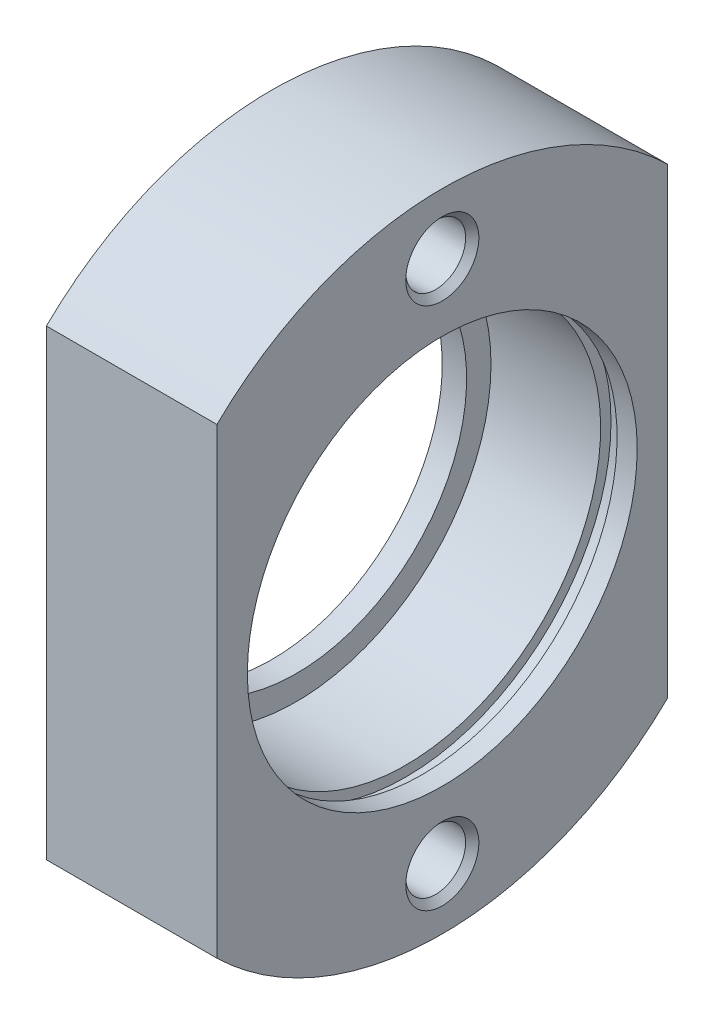
ISO-10303-21;
HEADER;
FILE_DESCRIPTION(('STEP AP214'),'2;1');
FILE_NAME('part.step','',(''),(''),'','','');
FILE_SCHEMA(('AUTOMOTIVE_DESIGN { 1 0 10303 214 1 1 1 1 }'));
ENDSEC;
DATA;
#1=APPLICATION_CONTEXT('core data for automotive mechanical design processes');
#2=APPLICATION_PROTOCOL_DEFINITION('international standard','automotive_design',2000,#1);
#3=PRODUCT_CONTEXT('',#1,'mechanical');
#4=PRODUCT('Part','Part','',(#3));
#5=PRODUCT_RELATED_PRODUCT_CATEGORY('part','',(#4));
#6=PRODUCT_DEFINITION_FORMATION('','',#4);
#7=PRODUCT_DEFINITION_CONTEXT('part definition',#1,'design');
#8=PRODUCT_DEFINITION('design','',#6,#7);
#9=PRODUCT_DEFINITION_SHAPE('','',#8);
#10=(LENGTH_UNIT() NAMED_UNIT(*) SI_UNIT(.MILLI.,.METRE.));
#11=(NAMED_UNIT(*) PLANE_ANGLE_UNIT() SI_UNIT($,.RADIAN.));
#12=(NAMED_UNIT(*) SI_UNIT($,.STERADIAN.) SOLID_ANGLE_UNIT());
#13=UNCERTAINTY_MEASURE_WITH_UNIT(LENGTH_MEASURE(1.E-05),#10,'distance_accuracy_value','');
#14=(GEOMETRIC_REPRESENTATION_CONTEXT(3) GLOBAL_UNCERTAINTY_ASSIGNED_CONTEXT((#13)) GLOBAL_UNIT_ASSIGNED_CONTEXT((#10,
#11,#12)) REPRESENTATION_CONTEXT('',''));
#15=CARTESIAN_POINT('',(0.,0.,0.));
#16=DIRECTION('',(0.,0.,1.));
#17=DIRECTION('',(1.,0.,0.));
#18=AXIS2_PLACEMENT_3D('',#15,#16,#17);
#19=CARTESIAN_POINT('',(7.,0.,0.));
#20=DIRECTION('',(-1.,0.,0.));
#21=DIRECTION('',(0.,0.,1.));
#22=AXIS2_PLACEMENT_3D('',#19,#20,#21);
#23=CYLINDRICAL_SURFACE('',#22,16.);
#24=CARTESIAN_POINT('',(-5.,0.,0.));
#25=DIRECTION('',(-1.,0.,0.));
#26=DIRECTION('',(0.,0.,1.));
#27=AXIS2_PLACEMENT_3D('',#24,#25,#26);
#28=CIRCLE('',#27,16.);
#29=CARTESIAN_POINT('',(-5.,0.,16.));
#30=VERTEX_POINT('',#29);
#31=EDGE_CURVE('E131',#30,#30,#28,.T.);
#32=ORIENTED_EDGE('',*,*,#31,.T.);
#33=EDGE_LOOP('',(#32));
#34=FACE_BOUND('',#33,.T.);
#35=CARTESIAN_POINT('',(3.99999999999996,0.,0.));
#36=DIRECTION('',(1.,0.,0.));
#37=DIRECTION('',(0.,1.,0.));
#38=AXIS2_PLACEMENT_3D('',#35,#36,#37);
#39=CIRCLE('',#38,16.);
#40=CARTESIAN_POINT('',(4.00000000000004,16.,0.));
#41=VERTEX_POINT('',#40);
#42=EDGE_CURVE('E37',#41,#41,#39,.T.);
#43=ORIENTED_EDGE('',*,*,#42,.T.);
#44=EDGE_LOOP('',(#43));
#45=FACE_BOUND('',#44,.T.);
#46=ADVANCED_FACE('F33',(#34,#45),#23,.F.);
#47=CARTESIAN_POINT('',(7.,0.,0.));
#48=DIRECTION('',(-1.,0.,0.));
#49=DIRECTION('',(0.,0.,1.));
#50=AXIS2_PLACEMENT_3D('',#47,#48,#49);
#51=CIRCLE('',#50,16.);
#52=CARTESIAN_POINT('',(7.,0.,16.));
#53=VERTEX_POINT('',#52);
#54=EDGE_CURVE('E118',#53,#53,#51,.T.);
#55=ORIENTED_EDGE('',*,*,#54,.F.);
#56=EDGE_LOOP('',(#55));
#57=FACE_BOUND('',#56,.T.);
#58=CARTESIAN_POINT('',(5.34999999999996,0.,0.));
#59=DIRECTION('',(-1.,0.,0.));
#60=DIRECTION('',(0.,-1.,0.));
#61=AXIS2_PLACEMENT_3D('',#58,#59,#60);
#62=CIRCLE('',#61,16.);
#63=CARTESIAN_POINT('',(5.34999999999987,-16.,0.));
#64=VERTEX_POINT('',#63);
#65=EDGE_CURVE('E112',#64,#64,#62,.T.);
#66=ORIENTED_EDGE('',*,*,#65,.T.);
#67=EDGE_LOOP('',(#66));
#68=FACE_BOUND('',#67,.T.);
#69=ADVANCED_FACE('F153',(#57,#68),#23,.F.);
#70=CARTESIAN_POINT('',(7.,-6.83481049534862E-13,0.));
#71=DIRECTION('',(-1.,0.,0.));
#72=DIRECTION('',(0.,0.,1.));
#73=AXIS2_PLACEMENT_3D('',#70,#71,#72);
#74=CYLINDRICAL_SURFACE('',#73,26.5000000000003);
#75=DIRECTION('',(-1.,0.,0.));
#76=VECTOR('',#75,1.);
#77=CARTESIAN_POINT('',(7.,18.97366596101,-18.5));
#78=LINE('',#77,#76);
#79=CARTESIAN_POINT('',(7.,18.97366596101,-18.5));
#80=VERTEX_POINT('',#79);
#81=CARTESIAN_POINT('',(-7.,18.97366596101,-18.5));
#82=VERTEX_POINT('',#81);
#83=EDGE_CURVE('E93',#80,#82,#78,.T.);
#84=ORIENTED_EDGE('',*,*,#83,.T.);
#85=CARTESIAN_POINT('',(-7.,-6.83481049534862E-13,0.));
#86=DIRECTION('',(1.,0.,0.));
#87=DIRECTION('',(0.,0.,-1.));
#88=AXIS2_PLACEMENT_3D('',#85,#86,#87);
#89=CIRCLE('',#88,26.5000000000003);
#90=CARTESIAN_POINT('',(-7.,18.97366596101,18.5));
#91=VERTEX_POINT('',#90);
#92=EDGE_CURVE('E88',#82,#91,#89,.T.);
#93=ORIENTED_EDGE('',*,*,#92,.T.);
#94=DIRECTION('',(-1.,0.,0.));
#95=VECTOR('',#94,1.);
#96=CARTESIAN_POINT('',(7.,18.97366596101,18.5));
#97=LINE('',#96,#95);
#98=CARTESIAN_POINT('',(7.,18.97366596101,18.5));
#99=VERTEX_POINT('',#98);
#100=EDGE_CURVE('E11',#99,#91,#97,.T.);
#101=ORIENTED_EDGE('',*,*,#100,.F.);
#102=CARTESIAN_POINT('',(7.,-6.83481049534862E-13,0.));
#103=DIRECTION('',(1.,0.,0.));
#104=DIRECTION('',(0.,0.,-1.));
#105=AXIS2_PLACEMENT_3D('',#102,#103,#104);
#106=CIRCLE('',#105,26.5000000000003);
#107=EDGE_CURVE('E104',#80,#99,#106,.T.);
#108=ORIENTED_EDGE('',*,*,#107,.F.);
#109=EDGE_LOOP('',(#84,#93,#101,#108));
#110=FACE_BOUND('',#109,.T.);
#111=ADVANCED_FACE('F35',(#110),#74,.T.);
#112=CARTESIAN_POINT('',(7.,18.97366596101,18.5));
#113=DIRECTION('',(0.,0.,-1.));
#114=DIRECTION('',(-1.,0.,0.));
#115=AXIS2_PLACEMENT_3D('',#112,#113,#114);
#116=PLANE('',#115);
#117=ORIENTED_EDGE('',*,*,#100,.T.);
#118=DIRECTION('',(0.,-1.,0.));
#119=VECTOR('',#118,1.);
#120=CARTESIAN_POINT('',(-7.,18.97366596101,18.5));
#121=LINE('',#120,#119);
#122=CARTESIAN_POINT('',(-7.,-18.97366596101,18.5));
#123=VERTEX_POINT('',#122);
#124=EDGE_CURVE('E78',#91,#123,#121,.T.);
#125=ORIENTED_EDGE('',*,*,#124,.T.);
#126=DIRECTION('',(-1.,0.,0.));
#127=VECTOR('',#126,1.);
#128=CARTESIAN_POINT('',(7.,-18.97366596101,18.5));
#129=LINE('',#128,#127);
#130=CARTESIAN_POINT('',(7.,-18.97366596101,18.5));
#131=VERTEX_POINT('',#130);
#132=EDGE_CURVE('E42',#131,#123,#129,.T.);
#133=ORIENTED_EDGE('',*,*,#132,.F.);
#134=DIRECTION('',(0.,-1.,0.));
#135=VECTOR('',#134,1.);
#136=CARTESIAN_POINT('',(7.,18.97366596101,18.5));
#137=LINE('',#136,#135);
#138=EDGE_CURVE('E79',#99,#131,#137,.T.);
#139=ORIENTED_EDGE('',*,*,#138,.F.);
#140=EDGE_LOOP('',(#117,#125,#133,#139));
#141=FACE_BOUND('',#140,.T.);
#142=ADVANCED_FACE('F76',(#141),#116,.F.);
#143=CARTESIAN_POINT('',(7.,-6.83481049534862E-13,0.));
#144=DIRECTION('',(-1.,0.,0.));
#145=DIRECTION('',(0.,0.,1.));
#146=AXIS2_PLACEMENT_3D('',#143,#144,#145);
#147=CYLINDRICAL_SURFACE('',#146,26.4999999999993);
#148=ORIENTED_EDGE('',*,*,#132,.T.);
#149=CARTESIAN_POINT('',(-7.,-6.83481049534862E-13,0.));
#150=DIRECTION('',(1.,0.,0.));
#151=DIRECTION('',(0.,0.,-1.));
#152=AXIS2_PLACEMENT_3D('',#149,#150,#151);
#153=CIRCLE('',#152,26.4999999999993);
#154=CARTESIAN_POINT('',(-7.,-18.97366596101,-18.5));
#155=VERTEX_POINT('',#154);
#156=EDGE_CURVE('E91',#123,#155,#153,.T.);
#157=ORIENTED_EDGE('',*,*,#156,.T.);
#158=DIRECTION('',(-1.,0.,0.));
#159=VECTOR('',#158,1.);
#160=CARTESIAN_POINT('',(7.,-18.97366596101,-18.5));
#161=LINE('',#160,#159);
#162=CARTESIAN_POINT('',(7.,-18.97366596101,-18.5));
#163=VERTEX_POINT('',#162);
#164=EDGE_CURVE('E110',#163,#155,#161,.T.);
#165=ORIENTED_EDGE('',*,*,#164,.F.);
#166=CARTESIAN_POINT('',(7.,-6.83481049534862E-13,0.));
#167=DIRECTION('',(1.,0.,0.));
#168=DIRECTION('',(0.,0.,-1.));
#169=AXIS2_PLACEMENT_3D('',#166,#167,#168);
#170=CIRCLE('',#169,26.4999999999993);
#171=EDGE_CURVE('E55',#131,#163,#170,.T.);
#172=ORIENTED_EDGE('',*,*,#171,.F.);
#173=EDGE_LOOP('',(#148,#157,#165,#172));
#174=FACE_BOUND('',#173,.T.);
#175=ADVANCED_FACE('F240',(#174),#147,.T.);
#176=CARTESIAN_POINT('',(7.,-18.97366596101,-18.5));
#177=DIRECTION('',(0.,0.,1.));
#178=DIRECTION('',(1.,0.,0.));
#179=AXIS2_PLACEMENT_3D('',#176,#177,#178);
#180=PLANE('',#179);
#181=ORIENTED_EDGE('',*,*,#164,.T.);
#182=DIRECTION('',(0.,1.,0.));
#183=VECTOR('',#182,1.);
#184=CARTESIAN_POINT('',(-7.,-18.97366596101,-18.5));
#185=LINE('',#184,#183);
#186=EDGE_CURVE('E102',#155,#82,#185,.T.);
#187=ORIENTED_EDGE('',*,*,#186,.T.);
#188=ORIENTED_EDGE('',*,*,#83,.F.);
#189=DIRECTION('',(0.,1.,0.));
#190=VECTOR('',#189,1.);
#191=CARTESIAN_POINT('',(7.,-18.97366596101,-18.5));
#192=LINE('',#191,#190);
#193=EDGE_CURVE('E50',#163,#80,#192,.T.);
#194=ORIENTED_EDGE('',*,*,#193,.F.);
#195=EDGE_LOOP('',(#181,#187,#188,#194));
#196=FACE_BOUND('',#195,.T.);
#197=ADVANCED_FACE('F236',(#196),#180,.F.);
#198=CARTESIAN_POINT('',(7.,-6.83481049534862E-13,0.));
#199=DIRECTION('',(1.,0.,0.));
#200=DIRECTION('',(0.,0.,-1.));
#201=AXIS2_PLACEMENT_3D('',#198,#199,#200);
#202=PLANE('',#201);
#203=CARTESIAN_POINT('',(7.,21.5,0.));
#204=DIRECTION('',(-1.,0.,0.));
#205=DIRECTION('',(0.,0.,1.));
#206=AXIS2_PLACEMENT_3D('',#203,#204,#205);
#207=CIRCLE('',#206,3.);
#208=CARTESIAN_POINT('',(7.,21.5,3.));
#209=VERTEX_POINT('',#208);
#210=EDGE_CURVE('E203',#209,#209,#207,.T.);
#211=ORIENTED_EDGE('',*,*,#210,.T.);
#212=EDGE_LOOP('',(#211));
#213=FACE_BOUND('',#212,.T.);
#214=CARTESIAN_POINT('',(7.,-21.5,0.));
#215=DIRECTION('',(-1.,0.,0.));
#216=DIRECTION('',(0.,0.,1.));
#217=AXIS2_PLACEMENT_3D('',#214,#215,#216);
#218=CIRCLE('',#217,3.);
#219=CARTESIAN_POINT('',(7.,-21.5,3.));
#220=VERTEX_POINT('',#219);
#221=EDGE_CURVE('E214',#220,#220,#218,.T.);
#222=ORIENTED_EDGE('',*,*,#221,.T.);
#223=EDGE_LOOP('',(#222));
#224=FACE_BOUND('',#223,.T.);
#225=ORIENTED_EDGE('',*,*,#54,.T.);
#226=EDGE_LOOP('',(#225));
#227=FACE_BOUND('',#226,.T.);
#228=ORIENTED_EDGE('',*,*,#107,.T.);
#229=ORIENTED_EDGE('',*,*,#138,.T.);
#230=ORIENTED_EDGE('',*,*,#171,.T.);
#231=ORIENTED_EDGE('',*,*,#193,.T.);
#232=EDGE_LOOP('',(#228,#229,#230,#231));
#233=FACE_BOUND('',#232,.T.);
#234=ADVANCED_FACE('F149',(#213,#224,#227,#233),#202,.T.);
#235=CARTESIAN_POINT('',(-7.,-6.83481049534862E-13,0.));
#236=DIRECTION('',(1.,0.,0.));
#237=DIRECTION('',(0.,0.,-1.));
#238=AXIS2_PLACEMENT_3D('',#235,#236,#237);
#239=PLANE('',#238);
#240=CARTESIAN_POINT('',(-7.,21.5,0.));
#241=DIRECTION('',(-1.,0.,0.));
#242=DIRECTION('',(0.,0.,1.));
#243=AXIS2_PLACEMENT_3D('',#240,#241,#242);
#244=CIRCLE('',#243,3.);
#245=CARTESIAN_POINT('',(-7.,21.5,3.));
#246=VERTEX_POINT('',#245);
#247=EDGE_CURVE('E211',#246,#246,#244,.T.);
#248=ORIENTED_EDGE('',*,*,#247,.F.);
#249=EDGE_LOOP('',(#248));
#250=FACE_BOUND('',#249,.T.);
#251=CARTESIAN_POINT('',(-7.,-21.5,0.));
#252=DIRECTION('',(-1.,0.,0.));
#253=DIRECTION('',(0.,0.,1.));
#254=AXIS2_PLACEMENT_3D('',#251,#252,#253);
#255=CIRCLE('',#254,3.);
#256=CARTESIAN_POINT('',(-7.,-21.5,3.));
#257=VERTEX_POINT('',#256);
#258=EDGE_CURVE('E125',#257,#257,#255,.T.);
#259=ORIENTED_EDGE('',*,*,#258,.F.);
#260=EDGE_LOOP('',(#259));
#261=FACE_BOUND('',#260,.T.);
#262=CARTESIAN_POINT('',(-7.,0.,0.));
#263=DIRECTION('',(-1.,0.,0.));
#264=DIRECTION('',(0.,0.,1.));
#265=AXIS2_PLACEMENT_3D('',#262,#263,#264);
#266=CIRCLE('',#265,14.);
#267=CARTESIAN_POINT('',(-7.,0.,14.));
#268=VERTEX_POINT('',#267);
#269=EDGE_CURVE('E94',#268,#268,#266,.T.);
#270=ORIENTED_EDGE('',*,*,#269,.F.);
#271=EDGE_LOOP('',(#270));
#272=FACE_BOUND('',#271,.T.);
#273=ORIENTED_EDGE('',*,*,#92,.F.);
#274=ORIENTED_EDGE('',*,*,#186,.F.);
#275=ORIENTED_EDGE('',*,*,#156,.F.);
#276=ORIENTED_EDGE('',*,*,#124,.F.);
#277=EDGE_LOOP('',(#273,#274,#275,#276));
#278=FACE_BOUND('',#277,.T.);
#279=ADVANCED_FACE('F86',(#250,#261,#272,#278),#239,.F.);
#280=CARTESIAN_POINT('',(7.,0.,0.));
#281=DIRECTION('',(-1.,0.,0.));
#282=DIRECTION('',(0.,0.,1.));
#283=AXIS2_PLACEMENT_3D('',#280,#281,#282);
#284=CYLINDRICAL_SURFACE('',#283,14.);
#285=ORIENTED_EDGE('',*,*,#269,.T.);
#286=EDGE_LOOP('',(#285));
#287=FACE_BOUND('',#286,.T.);
#288=CARTESIAN_POINT('',(-5.,0.,0.));
#289=DIRECTION('',(-1.,0.,0.));
#290=DIRECTION('',(0.,0.,1.));
#291=AXIS2_PLACEMENT_3D('',#288,#289,#290);
#292=CIRCLE('',#291,14.);
#293=CARTESIAN_POINT('',(-5.,0.,14.));
#294=VERTEX_POINT('',#293);
#295=EDGE_CURVE('E97',#294,#294,#292,.T.);
#296=ORIENTED_EDGE('',*,*,#295,.F.);
#297=EDGE_LOOP('',(#296));
#298=FACE_BOUND('',#297,.T.);
#299=ADVANCED_FACE('F139',(#287,#298),#284,.F.);
#300=CARTESIAN_POINT('',(-5.,14.,0.));
#301=DIRECTION('',(1.,0.,0.));
#302=DIRECTION('',(0.,0.,-1.));
#303=AXIS2_PLACEMENT_3D('',#300,#301,#302);
#304=PLANE('',#303);
#305=ORIENTED_EDGE('',*,*,#295,.T.);
#306=EDGE_LOOP('',(#305));
#307=FACE_BOUND('',#306,.T.);
#308=ORIENTED_EDGE('',*,*,#31,.F.);
#309=EDGE_LOOP('',(#308));
#310=FACE_BOUND('',#309,.T.);
#311=ADVANCED_FACE('F136',(#307,#310),#304,.T.);
#312=CARTESIAN_POINT('',(3.99999999999996,0.,0.));
#313=DIRECTION('',(1.,0.,0.));
#314=DIRECTION('',(0.,1.,0.));
#315=AXIS2_PLACEMENT_3D('',#312,#313,#314);
#316=PLANE('',#315);
#317=ORIENTED_EDGE('',*,*,#42,.F.);
#318=EDGE_LOOP('',(#317));
#319=FACE_BOUND('',#318,.T.);
#320=CARTESIAN_POINT('',(3.99999999999991,0.,0.));
#321=DIRECTION('',(-1.,0.,0.));
#322=DIRECTION('',(0.,-1.,0.));
#323=AXIS2_PLACEMENT_3D('',#320,#321,#322);
#324=CIRCLE('',#323,16.85);
#325=CARTESIAN_POINT('',(3.99999999999982,-16.85,0.));
#326=VERTEX_POINT('',#325);
#327=EDGE_CURVE('E114',#326,#326,#324,.T.);
#328=ORIENTED_EDGE('',*,*,#327,.F.);
#329=EDGE_LOOP('',(#328));
#330=FACE_BOUND('',#329,.T.);
#331=ADVANCED_FACE('F147',(#319,#330),#316,.T.);
#332=CARTESIAN_POINT('',(5.35,0.,0.));
#333=DIRECTION('',(-1.,0.,0.));
#334=DIRECTION('',(0.,-1.,0.));
#335=AXIS2_PLACEMENT_3D('',#332,#333,#334);
#336=CYLINDRICAL_SURFACE('',#335,16.85);
#337=ORIENTED_EDGE('',*,*,#327,.T.);
#338=EDGE_LOOP('',(#337));
#339=FACE_BOUND('',#338,.T.);
#340=CARTESIAN_POINT('',(5.34999999999991,0.,0.));
#341=DIRECTION('',(-1.,0.,0.));
#342=DIRECTION('',(0.,-1.,0.));
#343=AXIS2_PLACEMENT_3D('',#340,#341,#342);
#344=CIRCLE('',#343,16.85);
#345=CARTESIAN_POINT('',(5.34999999999982,-16.85,0.));
#346=VERTEX_POINT('',#345);
#347=EDGE_CURVE('E120',#346,#346,#344,.T.);
#348=ORIENTED_EDGE('',*,*,#347,.F.);
#349=EDGE_LOOP('',(#348));
#350=FACE_BOUND('',#349,.T.);
#351=ADVANCED_FACE('F164',(#339,#350),#336,.F.);
#352=CARTESIAN_POINT('',(5.35000000000004,16.85,0.));
#353=DIRECTION('',(-1.,0.,0.));
#354=DIRECTION('',(0.,-1.,0.));
#355=AXIS2_PLACEMENT_3D('',#352,#353,#354);
#356=PLANE('',#355);
#357=ORIENTED_EDGE('',*,*,#65,.F.);
#358=EDGE_LOOP('',(#357));
#359=FACE_BOUND('',#358,.T.);
#360=ORIENTED_EDGE('',*,*,#347,.T.);
#361=EDGE_LOOP('',(#360));
#362=FACE_BOUND('',#361,.T.);
#363=ADVANCED_FACE('F168',(#359,#362),#356,.T.);
#364=CARTESIAN_POINT('',(-6.4585,-21.5,0.));
#365=DIRECTION('',(-1.,0.,0.));
#366=DIRECTION('',(0.,0.,1.));
#367=AXIS2_PLACEMENT_3D('',#364,#365,#366);
#368=CONICAL_SURFACE('',#367,2.4585,0.785398163397448);
#369=ORIENTED_EDGE('',*,*,#258,.T.);
#370=EDGE_LOOP('',(#369));
#371=FACE_BOUND('',#370,.T.);
#372=CARTESIAN_POINT('',(-6.4585,-21.5,0.));
#373=DIRECTION('',(-1.,0.,0.));
#374=DIRECTION('',(0.,0.,1.));
#375=AXIS2_PLACEMENT_3D('',#372,#373,#374);
#376=CIRCLE('',#375,2.4585);
#377=CARTESIAN_POINT('',(-6.4585,-21.5,2.4585));
#378=VERTEX_POINT('',#377);
#379=EDGE_CURVE('E220',#378,#378,#376,.T.);
#380=ORIENTED_EDGE('',*,*,#379,.F.);
#381=EDGE_LOOP('',(#380));
#382=FACE_BOUND('',#381,.T.);
#383=ADVANCED_FACE('F171',(#371,#382),#368,.F.);
#384=CARTESIAN_POINT('',(7.,-21.5,0.));
#385=DIRECTION('',(-1.,0.,0.));
#386=DIRECTION('',(0.,0.,1.));
#387=AXIS2_PLACEMENT_3D('',#384,#385,#386);
#388=CYLINDRICAL_SURFACE('',#387,2.4585);
#389=ORIENTED_EDGE('',*,*,#379,.T.);
#390=EDGE_LOOP('',(#389));
#391=FACE_BOUND('',#390,.T.);
#392=CARTESIAN_POINT('',(6.4585,-21.5,0.));
#393=DIRECTION('',(-1.,0.,0.));
#394=DIRECTION('',(0.,0.,1.));
#395=AXIS2_PLACEMENT_3D('',#392,#393,#394);
#396=CIRCLE('',#395,2.4585);
#397=CARTESIAN_POINT('',(6.4585,-21.5,2.4585));
#398=VERTEX_POINT('',#397);
#399=EDGE_CURVE('E217',#398,#398,#396,.T.);
#400=ORIENTED_EDGE('',*,*,#399,.F.);
#401=EDGE_LOOP('',(#400));
#402=FACE_BOUND('',#401,.T.);
#403=ADVANCED_FACE('F175',(#391,#402),#388,.F.);
#404=CARTESIAN_POINT('',(7.,-21.5,0.));
#405=DIRECTION('',(1.,0.,0.));
#406=DIRECTION('',(0.,0.,-1.));
#407=AXIS2_PLACEMENT_3D('',#404,#405,#406);
#408=CONICAL_SURFACE('',#407,3.,0.785398163397448);
#409=ORIENTED_EDGE('',*,*,#399,.T.);
#410=EDGE_LOOP('',(#409));
#411=FACE_BOUND('',#410,.T.);
#412=ORIENTED_EDGE('',*,*,#221,.F.);
#413=EDGE_LOOP('',(#412));
#414=FACE_BOUND('',#413,.T.);
#415=ADVANCED_FACE('F179',(#411,#414),#408,.F.);
#416=CARTESIAN_POINT('',(-6.4585,21.5,0.));
#417=DIRECTION('',(-1.,0.,0.));
#418=DIRECTION('',(0.,0.,1.));
#419=AXIS2_PLACEMENT_3D('',#416,#417,#418);
#420=CONICAL_SURFACE('',#419,2.4585,0.785398163397448);
#421=ORIENTED_EDGE('',*,*,#247,.T.);
#422=EDGE_LOOP('',(#421));
#423=FACE_BOUND('',#422,.T.);
#424=CARTESIAN_POINT('',(-6.4585,21.5,0.));
#425=DIRECTION('',(-1.,0.,0.));
#426=DIRECTION('',(0.,0.,1.));
#427=AXIS2_PLACEMENT_3D('',#424,#425,#426);
#428=CIRCLE('',#427,2.4585);
#429=CARTESIAN_POINT('',(-6.4585,21.5,2.4585));
#430=VERTEX_POINT('',#429);
#431=EDGE_CURVE('E206',#430,#430,#428,.T.);
#432=ORIENTED_EDGE('',*,*,#431,.F.);
#433=EDGE_LOOP('',(#432));
#434=FACE_BOUND('',#433,.T.);
#435=ADVANCED_FACE('F183',(#423,#434),#420,.F.);
#436=CARTESIAN_POINT('',(7.,21.5,0.));
#437=DIRECTION('',(-1.,0.,0.));
#438=DIRECTION('',(0.,0.,1.));
#439=AXIS2_PLACEMENT_3D('',#436,#437,#438);
#440=CYLINDRICAL_SURFACE('',#439,2.4585);
#441=ORIENTED_EDGE('',*,*,#431,.T.);
#442=EDGE_LOOP('',(#441));
#443=FACE_BOUND('',#442,.T.);
#444=CARTESIAN_POINT('',(6.4585,21.5,0.));
#445=DIRECTION('',(-1.,0.,0.));
#446=DIRECTION('',(0.,0.,1.));
#447=AXIS2_PLACEMENT_3D('',#444,#445,#446);
#448=CIRCLE('',#447,2.4585);
#449=CARTESIAN_POINT('',(6.4585,21.5,2.4585));
#450=VERTEX_POINT('',#449);
#451=EDGE_CURVE('E200',#450,#450,#448,.T.);
#452=ORIENTED_EDGE('',*,*,#451,.F.);
#453=EDGE_LOOP('',(#452));
#454=FACE_BOUND('',#453,.T.);
#455=ADVANCED_FACE('F187',(#443,#454),#440,.F.);
#456=CARTESIAN_POINT('',(7.,21.5,0.));
#457=DIRECTION('',(1.,0.,0.));
#458=DIRECTION('',(0.,0.,-1.));
#459=AXIS2_PLACEMENT_3D('',#456,#457,#458);
#460=CONICAL_SURFACE('',#459,3.,0.785398163397448);
#461=ORIENTED_EDGE('',*,*,#451,.T.);
#462=EDGE_LOOP('',(#461));
#463=FACE_BOUND('',#462,.T.);
#464=ORIENTED_EDGE('',*,*,#210,.F.);
#465=EDGE_LOOP('',(#464));
#466=FACE_BOUND('',#465,.T.);
#467=ADVANCED_FACE('F191',(#463,#466),#460,.F.);
#468=CLOSED_SHELL('',(#46,#69,#111,#142,#175,#197,#234,#279,#299,#311,#331,#351,#363,#383,#403,
#415,#435,#455,#467));
#469=MANIFOLD_SOLID_BREP('B2',#468);
#470=ADVANCED_BREP_SHAPE_REPRESENTATION('',(#18,#469),#14);
#471=SHAPE_DEFINITION_REPRESENTATION(#9,#470);
ENDSEC;
END-ISO-10303-21;
